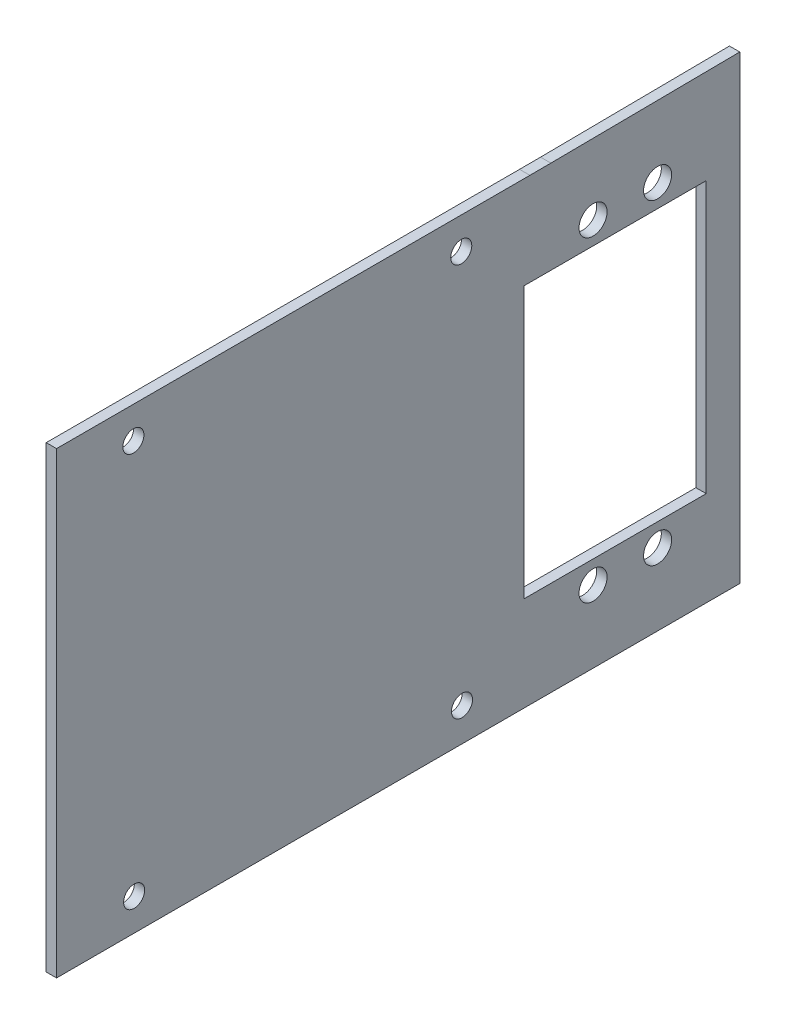
ISO-10303-21;
HEADER;
FILE_DESCRIPTION(('STEP AP214'),'2;1');
FILE_NAME('part.step','',(''),(''),'','','');
FILE_SCHEMA(('AUTOMOTIVE_DESIGN { 1 0 10303 214 1 1 1 1 }'));
ENDSEC;
DATA;
#1=APPLICATION_CONTEXT('core data for automotive mechanical design processes');
#2=APPLICATION_PROTOCOL_DEFINITION('international standard','automotive_design',2000,#1);
#3=PRODUCT_CONTEXT('',#1,'mechanical');
#4=PRODUCT('Part','Part','',(#3));
#5=PRODUCT_RELATED_PRODUCT_CATEGORY('part','',(#4));
#6=PRODUCT_DEFINITION_FORMATION('','',#4);
#7=PRODUCT_DEFINITION_CONTEXT('part definition',#1,'design');
#8=PRODUCT_DEFINITION('design','',#6,#7);
#9=PRODUCT_DEFINITION_SHAPE('','',#8);
#10=(LENGTH_UNIT() NAMED_UNIT(*) SI_UNIT(.MILLI.,.METRE.));
#11=(NAMED_UNIT(*) PLANE_ANGLE_UNIT() SI_UNIT($,.RADIAN.));
#12=(NAMED_UNIT(*) SI_UNIT($,.STERADIAN.) SOLID_ANGLE_UNIT());
#13=UNCERTAINTY_MEASURE_WITH_UNIT(LENGTH_MEASURE(1.E-05),#10,'distance_accuracy_value','');
#14=(GEOMETRIC_REPRESENTATION_CONTEXT(3) GLOBAL_UNCERTAINTY_ASSIGNED_CONTEXT((#13)) GLOBAL_UNIT_ASSIGNED_CONTEXT((#10,
#11,#12)) REPRESENTATION_CONTEXT('',''));
#15=CARTESIAN_POINT('',(0.,0.,0.));
#16=DIRECTION('',(0.,0.,1.));
#17=DIRECTION('',(1.,0.,0.));
#18=AXIS2_PLACEMENT_3D('',#15,#16,#17);
#19=CARTESIAN_POINT('',(2.55483041066384,0.,-24.4590309822833));
#20=DIRECTION('',(0.,0.,-1.));
#21=DIRECTION('',(0.,-1.,0.));
#22=AXIS2_PLACEMENT_3D('',#19,#20,#21);
#23=PLANE('',#22);
#24=DIRECTION('',(-1.,0.,0.));
#25=VECTOR('',#24,1.);
#26=CARTESIAN_POINT('',(2.55483041066384,2.25093971240042E-08,-24.4590309822833));
#27=LINE('',#26,#25);
#28=CARTESIAN_POINT('',(4.15503041066384,2.25093971240042E-08,-24.4590309822833));
#29=VERTEX_POINT('',#28);
#30=CARTESIAN_POINT('',(2.55483041066384,2.25093971240042E-08,-24.4590309822833));
#31=VERTEX_POINT('',#30);
#32=EDGE_CURVE('E49',#29,#31,#27,.T.);
#33=ORIENTED_EDGE('',*,*,#32,.F.);
#34=DIRECTION('',(0.,1.,0.));
#35=VECTOR('',#34,1.);
#36=CARTESIAN_POINT('',(4.15503041066384,0.,-24.4590309822833));
#37=LINE('',#36,#35);
#38=CARTESIAN_POINT('',(4.15503041066384,42.0000000225094,-24.4590309822833));
#39=VERTEX_POINT('',#38);
#40=EDGE_CURVE('E84',#39,#29,#37,.F.);
#41=ORIENTED_EDGE('',*,*,#40,.F.);
#42=DIRECTION('',(-1.,0.,0.));
#43=VECTOR('',#42,1.);
#44=CARTESIAN_POINT('',(2.55483041066385,42.0000000225094,-24.4590309822833));
#45=LINE('',#44,#43);
#46=CARTESIAN_POINT('',(2.55483041066385,42.0000000225094,-24.4590309822833));
#47=VERTEX_POINT('',#46);
#48=EDGE_CURVE('E65',#39,#47,#45,.T.);
#49=ORIENTED_EDGE('',*,*,#48,.T.);
#50=DIRECTION('',(0.,-1.,0.));
#51=VECTOR('',#50,1.);
#52=CARTESIAN_POINT('',(2.55483041066384,0.,-24.4590309822833));
#53=LINE('',#52,#51);
#54=EDGE_CURVE('E85',#47,#31,#53,.T.);
#55=ORIENTED_EDGE('',*,*,#54,.T.);
#56=EDGE_LOOP('',(#33,#41,#49,#55));
#57=FACE_BOUND('',#56,.T.);
#58=ADVANCED_FACE('F41',(#57),#23,.F.);
#59=CARTESIAN_POINT('',(2.55483041066385,42.0000000225094,-1.67903588676194));
#60=DIRECTION('',(0.,-1.,0.));
#61=DIRECTION('',(0.,0.,1.));
#62=AXIS2_PLACEMENT_3D('',#59,#60,#61);
#63=PLANE('',#62);
#64=ORIENTED_EDGE('',*,*,#48,.F.);
#65=DIRECTION('',(0.,0.,1.));
#66=VECTOR('',#65,1.);
#67=CARTESIAN_POINT('',(4.15503041066385,42.0000000225094,-1.67903588676194));
#68=LINE('',#67,#66);
#69=CARTESIAN_POINT('',(4.15503041066385,42.0000000225094,3.81000000000002));
#70=VERTEX_POINT('',#69);
#71=EDGE_CURVE('E100',#39,#70,#68,.T.);
#72=ORIENTED_EDGE('',*,*,#71,.T.);
#73=DIRECTION('',(-1.,0.,0.));
#74=VECTOR('',#73,1.);
#75=CARTESIAN_POINT('',(2.55483041066385,42.0000000225094,3.80999999999999));
#76=LINE('',#75,#74);
#77=CARTESIAN_POINT('',(2.55483041066385,42.0000000225094,3.80999999999999));
#78=VERTEX_POINT('',#77);
#79=EDGE_CURVE('E173',#70,#78,#76,.T.);
#80=ORIENTED_EDGE('',*,*,#79,.T.);
#81=DIRECTION('',(0.,0.,1.));
#82=VECTOR('',#81,1.);
#83=CARTESIAN_POINT('',(2.55483041066385,42.0000000225094,-1.67903588676194));
#84=LINE('',#83,#82);
#85=EDGE_CURVE('E152',#47,#78,#84,.T.);
#86=ORIENTED_EDGE('',*,*,#85,.F.);
#87=EDGE_LOOP('',(#64,#72,#80,#86));
#88=FACE_BOUND('',#87,.T.);
#89=ADVANCED_FACE('F170',(#88),#63,.T.);
#90=CARTESIAN_POINT('',(2.55483041066385,56.3940976093207,-1.14126356648633));
#91=DIRECTION('',(0.,-0.999954535756131,-0.00953553463323434));
#92=DIRECTION('',(0.,-0.00953553463323434,0.999954535756131));
#93=AXIS2_PLACEMENT_3D('',#90,#91,#92);
#94=PLANE('',#93);
#95=DIRECTION('',(-1.,0.,0.));
#96=VECTOR('',#95,1.);
#97=CARTESIAN_POINT('',(2.55483041066385,56.386973687143,-0.394205476098086));
#98=LINE('',#97,#96);
#99=CARTESIAN_POINT('',(4.15503041066385,56.386973687143,-0.394205476098086));
#100=VERTEX_POINT('',#99);
#101=CARTESIAN_POINT('',(2.55483041066385,56.386973687143,-0.394205476098086));
#102=VERTEX_POINT('',#101);
#103=EDGE_CURVE('E12',#100,#102,#98,.T.);
#104=ORIENTED_EDGE('',*,*,#103,.F.);
#105=DIRECTION('',(0.,-0.00953553463323434,0.999954535756131));
#106=VECTOR('',#105,1.);
#107=CARTESIAN_POINT('',(4.15503041066385,56.3940976093207,-1.14126356648633));
#108=LINE('',#107,#106);
#109=CARTESIAN_POINT('',(4.15503041066385,56.6660668038328,-29.6616182291907));
#110=VERTEX_POINT('',#109);
#111=EDGE_CURVE('E56',#110,#100,#108,.T.);
#112=ORIENTED_EDGE('',*,*,#111,.F.);
#113=DIRECTION('',(-1.,0.,0.));
#114=VECTOR('',#113,1.);
#115=CARTESIAN_POINT('',(2.55483041066385,56.6660668038328,-29.6616182291907));
#116=LINE('',#115,#114);
#117=CARTESIAN_POINT('',(2.55483041066385,56.6660668038328,-29.6616182291907));
#118=VERTEX_POINT('',#117);
#119=EDGE_CURVE('E130',#110,#118,#116,.T.);
#120=ORIENTED_EDGE('',*,*,#119,.T.);
#121=DIRECTION('',(0.,-0.00953553463323434,0.999954535756131));
#122=VECTOR('',#121,1.);
#123=CARTESIAN_POINT('',(2.55483041066385,56.3940976093207,-1.14126356648633));
#124=LINE('',#123,#122);
#125=EDGE_CURVE('E138',#118,#102,#124,.T.);
#126=ORIENTED_EDGE('',*,*,#125,.T.);
#127=EDGE_LOOP('',(#104,#112,#120,#126));
#128=FACE_BOUND('',#127,.T.);
#129=ADVANCED_FACE('F137',(#128),#94,.F.);
#130=CARTESIAN_POINT('',(2.55483041066384,0.,-29.6616182291907));
#131=DIRECTION('',(0.,0.,1.));
#132=DIRECTION('',(0.,1.,0.));
#133=AXIS2_PLACEMENT_3D('',#130,#131,#132);
#134=PLANE('',#133);
#135=ORIENTED_EDGE('',*,*,#119,.F.);
#136=DIRECTION('',(0.,1.,0.));
#137=VECTOR('',#136,1.);
#138=CARTESIAN_POINT('',(4.15503041066384,0.,-29.6616182291907));
#139=LINE('',#138,#137);
#140=CARTESIAN_POINT('',(4.15503041066384,-14.6647486988781,-29.6616182291907));
#141=VERTEX_POINT('',#140);
#142=EDGE_CURVE('E110',#141,#110,#139,.T.);
#143=ORIENTED_EDGE('',*,*,#142,.F.);
#144=DIRECTION('',(-1.,0.,0.));
#145=VECTOR('',#144,1.);
#146=CARTESIAN_POINT('',(2.55483041066384,-14.6647486988781,-29.6616182291907));
#147=LINE('',#146,#145);
#148=CARTESIAN_POINT('',(2.55483041066384,-14.6647486988781,-29.6616182291907));
#149=VERTEX_POINT('',#148);
#150=EDGE_CURVE('E127',#141,#149,#147,.T.);
#151=ORIENTED_EDGE('',*,*,#150,.T.);
#152=DIRECTION('',(0.,1.,0.));
#153=VECTOR('',#152,1.);
#154=CARTESIAN_POINT('',(2.55483041066384,0.,-29.6616182291907));
#155=LINE('',#154,#153);
#156=EDGE_CURVE('E149',#149,#118,#155,.T.);
#157=ORIENTED_EDGE('',*,*,#156,.T.);
#158=EDGE_LOOP('',(#135,#143,#151,#157));
#159=FACE_BOUND('',#158,.T.);
#160=ADVANCED_FACE('F154',(#159),#134,.F.);
#161=CARTESIAN_POINT('',(2.55483041066384,-14.6647486988781,-1.67903588676192));
#162=DIRECTION('',(0.,-1.,0.));
#163=DIRECTION('',(0.,0.,1.));
#164=AXIS2_PLACEMENT_3D('',#161,#162,#163);
#165=PLANE('',#164);
#166=ORIENTED_EDGE('',*,*,#150,.F.);
#167=DIRECTION('',(0.,0.,1.));
#168=VECTOR('',#167,1.);
#169=CARTESIAN_POINT('',(4.15503041066384,-14.6647486988781,-1.67903588676192));
#170=LINE('',#169,#168);
#171=CARTESIAN_POINT('',(4.15503041066384,-14.6647486988781,76.2));
#172=VERTEX_POINT('',#171);
#173=EDGE_CURVE('E107',#141,#172,#170,.T.);
#174=ORIENTED_EDGE('',*,*,#173,.T.);
#175=DIRECTION('',(-1.,0.,0.));
#176=VECTOR('',#175,1.);
#177=CARTESIAN_POINT('',(2.55483041066384,-14.6647486988781,76.2));
#178=LINE('',#177,#176);
#179=CARTESIAN_POINT('',(2.55483041066384,-14.6647486988781,76.2));
#180=VERTEX_POINT('',#179);
#181=EDGE_CURVE('E220',#172,#180,#178,.T.);
#182=ORIENTED_EDGE('',*,*,#181,.T.);
#183=DIRECTION('',(0.,0.,1.));
#184=VECTOR('',#183,1.);
#185=CARTESIAN_POINT('',(2.55483041066384,-14.6647486988781,-1.67903588676192));
#186=LINE('',#185,#184);
#187=EDGE_CURVE('E155',#149,#180,#186,.T.);
#188=ORIENTED_EDGE('',*,*,#187,.F.);
#189=EDGE_LOOP('',(#166,#174,#182,#188));
#190=FACE_BOUND('',#189,.T.);
#191=ADVANCED_FACE('F253',(#190),#165,.T.);
#192=CARTESIAN_POINT('',(2.55483041066384,-3.5,-16.9290358867619));
#193=DIRECTION('',(-1.,0.,0.));
#194=DIRECTION('',(0.,0.,1.));
#195=AXIS2_PLACEMENT_3D('',#192,#193,#194);
#196=CYLINDRICAL_SURFACE('',#195,2.17499999999999);
#197=CARTESIAN_POINT('',(2.55483041066384,-3.5,-16.9290358867619));
#198=DIRECTION('',(-1.,0.,0.));
#199=DIRECTION('',(0.,0.,1.));
#200=AXIS2_PLACEMENT_3D('',#197,#198,#199);
#201=CIRCLE('',#200,2.17499999999999);
#202=CARTESIAN_POINT('',(2.55483041066384,-3.5,-14.7540358867619));
#203=VERTEX_POINT('',#202);
#204=EDGE_CURVE('E126',#203,#203,#201,.T.);
#205=ORIENTED_EDGE('',*,*,#204,.T.);
#206=EDGE_LOOP('',(#205));
#207=FACE_BOUND('',#206,.T.);
#208=CARTESIAN_POINT('',(4.15503041066384,-3.5,-16.9290358867619));
#209=DIRECTION('',(-1.,0.,0.));
#210=DIRECTION('',(0.,0.,1.));
#211=AXIS2_PLACEMENT_3D('',#208,#209,#210);
#212=CIRCLE('',#211,2.17499999999999);
#213=CARTESIAN_POINT('',(4.15503041066384,-3.5,-14.7540358867619));
#214=VERTEX_POINT('',#213);
#215=EDGE_CURVE('E114',#214,#214,#212,.T.);
#216=ORIENTED_EDGE('',*,*,#215,.F.);
#217=EDGE_LOOP('',(#216));
#218=FACE_BOUND('',#217,.T.);
#219=ADVANCED_FACE('F307',(#207,#218),#196,.F.);
#220=CARTESIAN_POINT('',(2.55483041066384,-3.5,-6.92903588676193));
#221=DIRECTION('',(-1.,0.,0.));
#222=DIRECTION('',(0.,0.,1.));
#223=AXIS2_PLACEMENT_3D('',#220,#221,#222);
#224=CYLINDRICAL_SURFACE('',#223,2.17499999999999);
#225=CARTESIAN_POINT('',(2.55483041066384,-3.5,-6.92903588676193));
#226=DIRECTION('',(-1.,0.,0.));
#227=DIRECTION('',(0.,0.,1.));
#228=AXIS2_PLACEMENT_3D('',#225,#226,#227);
#229=CIRCLE('',#228,2.17499999999999);
#230=CARTESIAN_POINT('',(2.55483041066384,-3.5,-4.75403588676193));
#231=VERTEX_POINT('',#230);
#232=EDGE_CURVE('E223',#231,#231,#229,.T.);
#233=ORIENTED_EDGE('',*,*,#232,.T.);
#234=EDGE_LOOP('',(#233));
#235=FACE_BOUND('',#234,.T.);
#236=CARTESIAN_POINT('',(4.15503041066384,-3.5,-6.92903588676193));
#237=DIRECTION('',(-1.,0.,0.));
#238=DIRECTION('',(0.,0.,1.));
#239=AXIS2_PLACEMENT_3D('',#236,#237,#238);
#240=CIRCLE('',#239,2.17499999999999);
#241=CARTESIAN_POINT('',(4.15503041066384,-3.5,-4.75403588676193));
#242=VERTEX_POINT('',#241);
#243=EDGE_CURVE('E117',#242,#242,#240,.T.);
#244=ORIENTED_EDGE('',*,*,#243,.F.);
#245=EDGE_LOOP('',(#244));
#246=FACE_BOUND('',#245,.T.);
#247=ADVANCED_FACE('F310',(#235,#246),#224,.F.);
#248=CARTESIAN_POINT('',(2.55483041066385,45.5000000450188,-16.9290358867619));
#249=DIRECTION('',(-1.,0.,0.));
#250=DIRECTION('',(0.,0.,1.));
#251=AXIS2_PLACEMENT_3D('',#248,#249,#250);
#252=CYLINDRICAL_SURFACE('',#251,2.175);
#253=CARTESIAN_POINT('',(2.55483041066385,45.5000000450188,-16.9290358867619));
#254=DIRECTION('',(-1.,0.,0.));
#255=DIRECTION('',(0.,0.,1.));
#256=AXIS2_PLACEMENT_3D('',#253,#254,#255);
#257=CIRCLE('',#256,2.175);
#258=CARTESIAN_POINT('',(2.55483041066385,45.5000000450188,-14.7540358867619));
#259=VERTEX_POINT('',#258);
#260=EDGE_CURVE('E226',#259,#259,#257,.F.);
#261=ORIENTED_EDGE('',*,*,#260,.F.);
#262=EDGE_LOOP('',(#261));
#263=FACE_BOUND('',#262,.T.);
#264=CARTESIAN_POINT('',(4.15503041066385,45.5000000450188,-16.9290358867619));
#265=DIRECTION('',(-1.,0.,0.));
#266=DIRECTION('',(0.,0.,1.));
#267=AXIS2_PLACEMENT_3D('',#264,#265,#266);
#268=CIRCLE('',#267,2.175);
#269=CARTESIAN_POINT('',(4.15503041066385,45.5000000450188,-14.7540358867619));
#270=VERTEX_POINT('',#269);
#271=EDGE_CURVE('E121',#270,#270,#268,.F.);
#272=ORIENTED_EDGE('',*,*,#271,.T.);
#273=EDGE_LOOP('',(#272));
#274=FACE_BOUND('',#273,.T.);
#275=ADVANCED_FACE('F314',(#263,#274),#252,.F.);
#276=CARTESIAN_POINT('',(2.55483041066385,45.5000000450188,-6.92903588676193));
#277=DIRECTION('',(-1.,0.,0.));
#278=DIRECTION('',(0.,0.,1.));
#279=AXIS2_PLACEMENT_3D('',#276,#277,#278);
#280=CYLINDRICAL_SURFACE('',#279,2.17499999999999);
#281=CARTESIAN_POINT('',(2.55483041066385,45.5000000450188,-6.92903588676193));
#282=DIRECTION('',(-1.,0.,0.));
#283=DIRECTION('',(0.,0.,1.));
#284=AXIS2_PLACEMENT_3D('',#281,#282,#283);
#285=CIRCLE('',#284,2.17499999999999);
#286=CARTESIAN_POINT('',(2.55483041066385,45.5000000450188,-4.75403588676193));
#287=VERTEX_POINT('',#286);
#288=EDGE_CURVE('E131',#287,#287,#285,.F.);
#289=ORIENTED_EDGE('',*,*,#288,.F.);
#290=EDGE_LOOP('',(#289));
#291=FACE_BOUND('',#290,.T.);
#292=CARTESIAN_POINT('',(4.15503041066385,45.5000000450188,-6.92903588676193));
#293=DIRECTION('',(-1.,0.,0.));
#294=DIRECTION('',(0.,0.,1.));
#295=AXIS2_PLACEMENT_3D('',#292,#293,#294);
#296=CIRCLE('',#295,2.17499999999999);
#297=CARTESIAN_POINT('',(4.15503041066385,45.5000000450188,-4.75403588676193));
#298=VERTEX_POINT('',#297);
#299=EDGE_CURVE('E101',#298,#298,#296,.F.);
#300=ORIENTED_EDGE('',*,*,#299,.T.);
#301=EDGE_LOOP('',(#300));
#302=FACE_BOUND('',#301,.T.);
#303=ADVANCED_FACE('F306',(#291,#302),#280,.F.);
#304=CARTESIAN_POINT('',(2.55483041066384,2.25093971240042E-08,-1.67903588676192));
#305=DIRECTION('',(0.,-1.,0.));
#306=DIRECTION('',(0.,0.,1.));
#307=AXIS2_PLACEMENT_3D('',#304,#305,#306);
#308=PLANE('',#307);
#309=DIRECTION('',(0.,0.,1.));
#310=VECTOR('',#309,1.);
#311=CARTESIAN_POINT('',(4.15503041066384,2.25093971240042E-08,-1.67903588676192));
#312=LINE('',#311,#310);
#313=CARTESIAN_POINT('',(4.15503041066384,2.25093971240042E-08,3.81000000000002));
#314=VERTEX_POINT('',#313);
#315=EDGE_CURVE('E97',#29,#314,#312,.T.);
#316=ORIENTED_EDGE('',*,*,#315,.F.);
#317=ORIENTED_EDGE('',*,*,#32,.T.);
#318=DIRECTION('',(0.,0.,1.));
#319=VECTOR('',#318,1.);
#320=CARTESIAN_POINT('',(2.55483041066384,2.25093971240042E-08,-1.67903588676192));
#321=LINE('',#320,#319);
#322=CARTESIAN_POINT('',(2.55483041066384,2.25093971240042E-08,3.80999999999999));
#323=VERTEX_POINT('',#322);
#324=EDGE_CURVE('E157',#31,#323,#321,.T.);
#325=ORIENTED_EDGE('',*,*,#324,.T.);
#326=DIRECTION('',(-1.,0.,0.));
#327=VECTOR('',#326,1.);
#328=CARTESIAN_POINT('',(2.55483041066384,2.25093971240042E-08,3.80999999999999));
#329=LINE('',#328,#327);
#330=EDGE_CURVE('E105',#314,#323,#329,.T.);
#331=ORIENTED_EDGE('',*,*,#330,.F.);
#332=EDGE_LOOP('',(#316,#317,#325,#331));
#333=FACE_BOUND('',#332,.T.);
#334=ADVANCED_FACE('F103',(#333),#308,.F.);
#335=CARTESIAN_POINT('',(2.55483041066385,56.3748630075559,76.2));
#336=DIRECTION('',(-1.,0.,0.));
#337=DIRECTION('',(0.,-1.,0.));
#338=AXIS2_PLACEMENT_3D('',#335,#336,#337);
#339=PLANE('',#338);
#340=ORIENTED_EDGE('',*,*,#85,.T.);
#341=DIRECTION('',(0.,1.,0.));
#342=VECTOR('',#341,1.);
#343=CARTESIAN_POINT('',(2.55483041066384,2.25093971240042E-08,3.80999999999999));
#344=LINE('',#343,#342);
#345=EDGE_CURVE('E182',#323,#78,#344,.T.);
#346=ORIENTED_EDGE('',*,*,#345,.F.);
#347=ORIENTED_EDGE('',*,*,#324,.F.);
#348=ORIENTED_EDGE('',*,*,#54,.F.);
#349=EDGE_LOOP('',(#340,#346,#347,#348));
#350=FACE_BOUND('',#349,.T.);
#351=ORIENTED_EDGE('',*,*,#204,.F.);
#352=EDGE_LOOP('',(#351));
#353=FACE_BOUND('',#352,.T.);
#354=ORIENTED_EDGE('',*,*,#232,.F.);
#355=EDGE_LOOP('',(#354));
#356=FACE_BOUND('',#355,.T.);
#357=ORIENTED_EDGE('',*,*,#260,.T.);
#358=EDGE_LOOP('',(#357));
#359=FACE_BOUND('',#358,.T.);
#360=DIRECTION('',(0.,0.,-1.));
#361=VECTOR('',#360,1.);
#362=CARTESIAN_POINT('',(2.55483041066385,56.3748630075559,76.2));
#363=LINE('',#362,#361);
#364=CARTESIAN_POINT('',(2.55483041066385,56.3748630075559,76.2));
#365=VERTEX_POINT('',#364);
#366=CARTESIAN_POINT('',(2.55483041066385,56.3748630075559,2.85750000000003));
#367=VERTEX_POINT('',#366);
#368=EDGE_CURVE('E194',#365,#367,#363,.T.);
#369=ORIENTED_EDGE('',*,*,#368,.T.);
#370=DIRECTION('',(0.,0.00372438269149556,-0.999993064462733));
#371=VECTOR('',#370,1.);
#372=CARTESIAN_POINT('',(2.55483041066385,56.374863007556,2.8575));
#373=LINE('',#372,#371);
#374=EDGE_CURVE('E118',#367,#102,#373,.T.);
#375=ORIENTED_EDGE('',*,*,#374,.T.);
#376=ORIENTED_EDGE('',*,*,#125,.F.);
#377=ORIENTED_EDGE('',*,*,#156,.F.);
#378=ORIENTED_EDGE('',*,*,#187,.T.);
#379=DIRECTION('',(0.,1.,0.));
#380=VECTOR('',#379,1.);
#381=CARTESIAN_POINT('',(2.55483041066385,56.3748630075559,76.2));
#382=LINE('',#381,#380);
#383=EDGE_CURVE('E183',#180,#365,#382,.T.);
#384=ORIENTED_EDGE('',*,*,#383,.T.);
#385=EDGE_LOOP('',(#369,#375,#376,#377,#378,#384));
#386=FACE_BOUND('',#385,.T.);
#387=ORIENTED_EDGE('',*,*,#288,.T.);
#388=EDGE_LOOP('',(#387));
#389=FACE_BOUND('',#388,.T.);
#390=CARTESIAN_POINT('',(2.55483041066384,-9.50555666323026,13.3777957054636));
#391=DIRECTION('',(-1.,0.,0.));
#392=DIRECTION('',(0.,1.,0.));
#393=AXIS2_PLACEMENT_3D('',#390,#391,#392);
#394=CIRCLE('',#393,1.63195);
#395=CARTESIAN_POINT('',(2.55483041066384,-7.87360666323026,13.3777957054636));
#396=VERTEX_POINT('',#395);
#397=EDGE_CURVE('E204',#396,#396,#394,.T.);
#398=ORIENTED_EDGE('',*,*,#397,.F.);
#399=EDGE_LOOP('',(#398));
#400=FACE_BOUND('',#399,.T.);
#401=CARTESIAN_POINT('',(2.55483041066384,-9.69881312156454,64.1774281051308));
#402=DIRECTION('',(-1.,0.,0.));
#403=DIRECTION('',(0.,-1.,0.));
#404=AXIS2_PLACEMENT_3D('',#401,#402,#403);
#405=CIRCLE('',#404,1.63195);
#406=CARTESIAN_POINT('',(2.55483041066384,-11.3307631215645,64.1774281051308));
#407=VERTEX_POINT('',#406);
#408=EDGE_CURVE('E207',#407,#407,#405,.T.);
#409=ORIENTED_EDGE('',*,*,#408,.F.);
#410=EDGE_LOOP('',(#409));
#411=FACE_BOUND('',#410,.T.);
#412=CARTESIAN_POINT('',(2.55483041066385,51.4544433367697,64.29375));
#413=DIRECTION('',(-1.,0.,0.));
#414=DIRECTION('',(0.,1.,0.));
#415=AXIS2_PLACEMENT_3D('',#412,#413,#414);
#416=CIRCLE('',#415,1.63195000000001);
#417=CARTESIAN_POINT('',(2.55483041066385,53.0863933367697,64.29375));
#418=VERTEX_POINT('',#417);
#419=EDGE_CURVE('E210',#418,#418,#416,.T.);
#420=ORIENTED_EDGE('',*,*,#419,.F.);
#421=EDGE_LOOP('',(#420));
#422=FACE_BOUND('',#421,.T.);
#423=CARTESIAN_POINT('',(2.55483041066385,51.4544433367697,13.49375));
#424=DIRECTION('',(-1.,0.,0.));
#425=DIRECTION('',(0.,-1.,0.));
#426=AXIS2_PLACEMENT_3D('',#423,#424,#425);
#427=CIRCLE('',#426,1.63195);
#428=CARTESIAN_POINT('',(2.55483041066385,49.8224933367697,13.49375));
#429=VERTEX_POINT('',#428);
#430=EDGE_CURVE('E213',#429,#429,#427,.T.);
#431=ORIENTED_EDGE('',*,*,#430,.F.);
#432=EDGE_LOOP('',(#431));
#433=FACE_BOUND('',#432,.T.);
#434=ADVANCED_FACE('F43',(#350,#353,#356,#359,#386,#389,#400,#411,#422,#433),#339,.T.);
#435=CARTESIAN_POINT('',(4.15503041066384,0.,-1.67903588676192));
#436=DIRECTION('',(-1.,0.,0.));
#437=DIRECTION('',(0.,0.,1.));
#438=AXIS2_PLACEMENT_3D('',#435,#436,#437);
#439=PLANE('',#438);
#440=DIRECTION('',(0.,-1.,0.));
#441=VECTOR('',#440,1.);
#442=CARTESIAN_POINT('',(4.15503041066385,56.3748630075559,76.2));
#443=LINE('',#442,#441);
#444=CARTESIAN_POINT('',(4.15503041066385,56.3748630075559,76.2));
#445=VERTEX_POINT('',#444);
#446=EDGE_CURVE('E201',#172,#445,#443,.F.);
#447=ORIENTED_EDGE('',*,*,#446,.F.);
#448=ORIENTED_EDGE('',*,*,#173,.F.);
#449=ORIENTED_EDGE('',*,*,#142,.T.);
#450=ORIENTED_EDGE('',*,*,#111,.T.);
#451=DIRECTION('',(0.,0.00372438269149556,-0.999993064462733));
#452=VECTOR('',#451,1.);
#453=CARTESIAN_POINT('',(4.15503041066385,56.374863007556,2.8575));
#454=LINE('',#453,#452);
#455=CARTESIAN_POINT('',(4.15503041066385,56.3748630075559,2.85750000000005));
#456=VERTEX_POINT('',#455);
#457=EDGE_CURVE('E217',#456,#100,#454,.T.);
#458=ORIENTED_EDGE('',*,*,#457,.F.);
#459=DIRECTION('',(0.,0.,1.));
#460=VECTOR('',#459,1.);
#461=CARTESIAN_POINT('',(4.15503041066385,56.3748630075559,76.2));
#462=LINE('',#461,#460);
#463=EDGE_CURVE('E264',#445,#456,#462,.F.);
#464=ORIENTED_EDGE('',*,*,#463,.F.);
#465=EDGE_LOOP('',(#447,#448,#449,#450,#458,#464));
#466=FACE_BOUND('',#465,.T.);
#467=ORIENTED_EDGE('',*,*,#215,.T.);
#468=EDGE_LOOP('',(#467));
#469=FACE_BOUND('',#468,.T.);
#470=ORIENTED_EDGE('',*,*,#243,.T.);
#471=EDGE_LOOP('',(#470));
#472=FACE_BOUND('',#471,.T.);
#473=ORIENTED_EDGE('',*,*,#271,.F.);
#474=EDGE_LOOP('',(#473));
#475=FACE_BOUND('',#474,.T.);
#476=ORIENTED_EDGE('',*,*,#71,.F.);
#477=ORIENTED_EDGE('',*,*,#40,.T.);
#478=ORIENTED_EDGE('',*,*,#315,.T.);
#479=DIRECTION('',(0.,-1.,0.));
#480=VECTOR('',#479,1.);
#481=CARTESIAN_POINT('',(4.15503041066385,56.3748630075559,3.81000000000002));
#482=LINE('',#481,#480);
#483=EDGE_CURVE('E180',#314,#70,#482,.F.);
#484=ORIENTED_EDGE('',*,*,#483,.T.);
#485=EDGE_LOOP('',(#476,#477,#478,#484));
#486=FACE_BOUND('',#485,.T.);
#487=ORIENTED_EDGE('',*,*,#299,.F.);
#488=EDGE_LOOP('',(#487));
#489=FACE_BOUND('',#488,.T.);
#490=CARTESIAN_POINT('',(4.15503041066384,-9.50555666323026,13.3777957054636));
#491=DIRECTION('',(-1.,0.,0.));
#492=DIRECTION('',(0.,-1.,0.));
#493=AXIS2_PLACEMENT_3D('',#490,#491,#492);
#494=CIRCLE('',#493,1.63195);
#495=CARTESIAN_POINT('',(4.15503041066384,-11.1375066632303,13.3777957054636));
#496=VERTEX_POINT('',#495);
#497=EDGE_CURVE('E185',#496,#496,#494,.T.);
#498=ORIENTED_EDGE('',*,*,#497,.T.);
#499=EDGE_LOOP('',(#498));
#500=FACE_BOUND('',#499,.T.);
#501=CARTESIAN_POINT('',(4.15503041066384,-9.69881312156454,64.1774281051308));
#502=DIRECTION('',(-1.,0.,0.));
#503=DIRECTION('',(0.,-1.,0.));
#504=AXIS2_PLACEMENT_3D('',#501,#502,#503);
#505=CIRCLE('',#504,1.63195);
#506=CARTESIAN_POINT('',(4.15503041066384,-11.3307631215645,64.1774281051308));
#507=VERTEX_POINT('',#506);
#508=EDGE_CURVE('E188',#507,#507,#505,.T.);
#509=ORIENTED_EDGE('',*,*,#508,.T.);
#510=EDGE_LOOP('',(#509));
#511=FACE_BOUND('',#510,.T.);
#512=CARTESIAN_POINT('',(4.15503041066385,51.4544433367697,64.29375));
#513=DIRECTION('',(-1.,0.,0.));
#514=DIRECTION('',(0.,-1.,0.));
#515=AXIS2_PLACEMENT_3D('',#512,#513,#514);
#516=CIRCLE('',#515,1.63195000000001);
#517=CARTESIAN_POINT('',(4.15503041066385,49.8224933367697,64.29375));
#518=VERTEX_POINT('',#517);
#519=EDGE_CURVE('E271',#518,#518,#516,.T.);
#520=ORIENTED_EDGE('',*,*,#519,.T.);
#521=EDGE_LOOP('',(#520));
#522=FACE_BOUND('',#521,.T.);
#523=CARTESIAN_POINT('',(4.15503041066385,51.4544433367697,13.49375));
#524=DIRECTION('',(-1.,0.,0.));
#525=DIRECTION('',(0.,-1.,0.));
#526=AXIS2_PLACEMENT_3D('',#523,#524,#525);
#527=CIRCLE('',#526,1.63195);
#528=CARTESIAN_POINT('',(4.15503041066385,49.8224933367697,13.49375));
#529=VERTEX_POINT('',#528);
#530=EDGE_CURVE('E267',#529,#529,#527,.T.);
#531=ORIENTED_EDGE('',*,*,#530,.T.);
#532=EDGE_LOOP('',(#531));
#533=FACE_BOUND('',#532,.T.);
#534=ADVANCED_FACE('F93',(#466,#469,#472,#475,#486,#489,#500,#511,#522,#533),#439,.F.);
#535=CARTESIAN_POINT('',(3.35493041066385,56.374863007556,2.8575));
#536=DIRECTION('',(0.,0.999993064462733,0.00372438269149556));
#537=DIRECTION('',(0.,0.00372438269149556,-0.999993064462733));
#538=AXIS2_PLACEMENT_3D('',#535,#536,#537);
#539=PLANE('',#538);
#540=DIRECTION('',(-1.,0.,0.));
#541=VECTOR('',#540,1.);
#542=CARTESIAN_POINT('',(2.55483041066385,56.3748630075559,2.85750000000003));
#543=LINE('',#542,#541);
#544=EDGE_CURVE('E257',#456,#367,#543,.T.);
#545=ORIENTED_EDGE('',*,*,#544,.F.);
#546=ORIENTED_EDGE('',*,*,#457,.T.);
#547=ORIENTED_EDGE('',*,*,#103,.T.);
#548=ORIENTED_EDGE('',*,*,#374,.F.);
#549=EDGE_LOOP('',(#545,#546,#547,#548));
#550=FACE_BOUND('',#549,.T.);
#551=ADVANCED_FACE('F328',(#550),#539,.T.);
#552=CARTESIAN_POINT('',(2.55483041066385,51.4544433367697,13.49375));
#553=DIRECTION('',(-1.,0.,0.));
#554=DIRECTION('',(0.,-1.,0.));
#555=AXIS2_PLACEMENT_3D('',#552,#553,#554);
#556=CYLINDRICAL_SURFACE('',#555,1.63195);
#557=ORIENTED_EDGE('',*,*,#430,.T.);
#558=EDGE_LOOP('',(#557));
#559=FACE_BOUND('',#558,.T.);
#560=ORIENTED_EDGE('',*,*,#530,.F.);
#561=EDGE_LOOP('',(#560));
#562=FACE_BOUND('',#561,.T.);
#563=ADVANCED_FACE('F292',(#559,#562),#556,.F.);
#564=CARTESIAN_POINT('',(2.55483041066385,51.4544433367697,64.29375));
#565=DIRECTION('',(-1.,0.,0.));
#566=DIRECTION('',(0.,-1.,0.));
#567=AXIS2_PLACEMENT_3D('',#564,#565,#566);
#568=CYLINDRICAL_SURFACE('',#567,1.63195000000001);
#569=ORIENTED_EDGE('',*,*,#419,.T.);
#570=EDGE_LOOP('',(#569));
#571=FACE_BOUND('',#570,.T.);
#572=ORIENTED_EDGE('',*,*,#519,.F.);
#573=EDGE_LOOP('',(#572));
#574=FACE_BOUND('',#573,.T.);
#575=ADVANCED_FACE('F283',(#571,#574),#568,.F.);
#576=CARTESIAN_POINT('',(2.55483041066384,-9.69881312156454,64.1774281051308));
#577=DIRECTION('',(-1.,0.,0.));
#578=DIRECTION('',(0.,-1.,0.));
#579=AXIS2_PLACEMENT_3D('',#576,#577,#578);
#580=CYLINDRICAL_SURFACE('',#579,1.63195);
#581=ORIENTED_EDGE('',*,*,#408,.T.);
#582=EDGE_LOOP('',(#581));
#583=FACE_BOUND('',#582,.T.);
#584=ORIENTED_EDGE('',*,*,#508,.F.);
#585=EDGE_LOOP('',(#584));
#586=FACE_BOUND('',#585,.T.);
#587=ADVANCED_FACE('F280',(#583,#586),#580,.F.);
#588=CARTESIAN_POINT('',(2.55483041066384,-9.50555666323026,13.3777957054636));
#589=DIRECTION('',(-1.,0.,0.));
#590=DIRECTION('',(0.,-1.,0.));
#591=AXIS2_PLACEMENT_3D('',#588,#589,#590);
#592=CYLINDRICAL_SURFACE('',#591,1.63195);
#593=ORIENTED_EDGE('',*,*,#397,.T.);
#594=EDGE_LOOP('',(#593));
#595=FACE_BOUND('',#594,.T.);
#596=ORIENTED_EDGE('',*,*,#497,.F.);
#597=EDGE_LOOP('',(#596));
#598=FACE_BOUND('',#597,.T.);
#599=ADVANCED_FACE('F282',(#595,#598),#592,.F.);
#600=CARTESIAN_POINT('',(2.55483041066385,56.3748630075559,76.2));
#601=DIRECTION('',(0.,0.,1.));
#602=DIRECTION('',(0.,1.,0.));
#603=AXIS2_PLACEMENT_3D('',#600,#601,#602);
#604=PLANE('',#603);
#605=ORIENTED_EDGE('',*,*,#181,.F.);
#606=ORIENTED_EDGE('',*,*,#446,.T.);
#607=DIRECTION('',(-1.,0.,0.));
#608=VECTOR('',#607,1.);
#609=CARTESIAN_POINT('',(2.55483041066385,56.3748630075559,76.2));
#610=LINE('',#609,#608);
#611=EDGE_CURVE('E198',#445,#365,#610,.T.);
#612=ORIENTED_EDGE('',*,*,#611,.T.);
#613=ORIENTED_EDGE('',*,*,#383,.F.);
#614=EDGE_LOOP('',(#605,#606,#612,#613));
#615=FACE_BOUND('',#614,.T.);
#616=ADVANCED_FACE('F259',(#615),#604,.T.);
#617=CARTESIAN_POINT('',(2.55483041066384,2.25093971240042E-08,3.80999999999999));
#618=DIRECTION('',(0.,0.,1.));
#619=DIRECTION('',(0.,1.,0.));
#620=AXIS2_PLACEMENT_3D('',#617,#618,#619);
#621=PLANE('',#620);
#622=ORIENTED_EDGE('',*,*,#79,.F.);
#623=ORIENTED_EDGE('',*,*,#483,.F.);
#624=ORIENTED_EDGE('',*,*,#330,.T.);
#625=ORIENTED_EDGE('',*,*,#345,.T.);
#626=EDGE_LOOP('',(#622,#623,#624,#625));
#627=FACE_BOUND('',#626,.T.);
#628=ADVANCED_FACE('F179',(#627),#621,.F.);
#629=CARTESIAN_POINT('',(2.55483041066385,56.3748630075559,76.2));
#630=DIRECTION('',(0.,1.,0.));
#631=DIRECTION('',(0.,0.,-1.));
#632=AXIS2_PLACEMENT_3D('',#629,#630,#631);
#633=PLANE('',#632);
#634=ORIENTED_EDGE('',*,*,#611,.F.);
#635=ORIENTED_EDGE('',*,*,#463,.T.);
#636=ORIENTED_EDGE('',*,*,#544,.T.);
#637=ORIENTED_EDGE('',*,*,#368,.F.);
#638=EDGE_LOOP('',(#634,#635,#636,#637));
#639=FACE_BOUND('',#638,.T.);
#640=ADVANCED_FACE('F262',(#639),#633,.T.);
#641=CLOSED_SHELL('',(#58,#89,#129,#160,#191,#219,#247,#275,#303,#334,#434,#534,#551,#563,#575,
#587,#599,#616,#628,#640));
#642=MANIFOLD_SOLID_BREP('B2',#641);
#643=ADVANCED_BREP_SHAPE_REPRESENTATION('',(#18,#642),#14);
#644=SHAPE_DEFINITION_REPRESENTATION(#9,#643);
ENDSEC;
END-ISO-10303-21;
